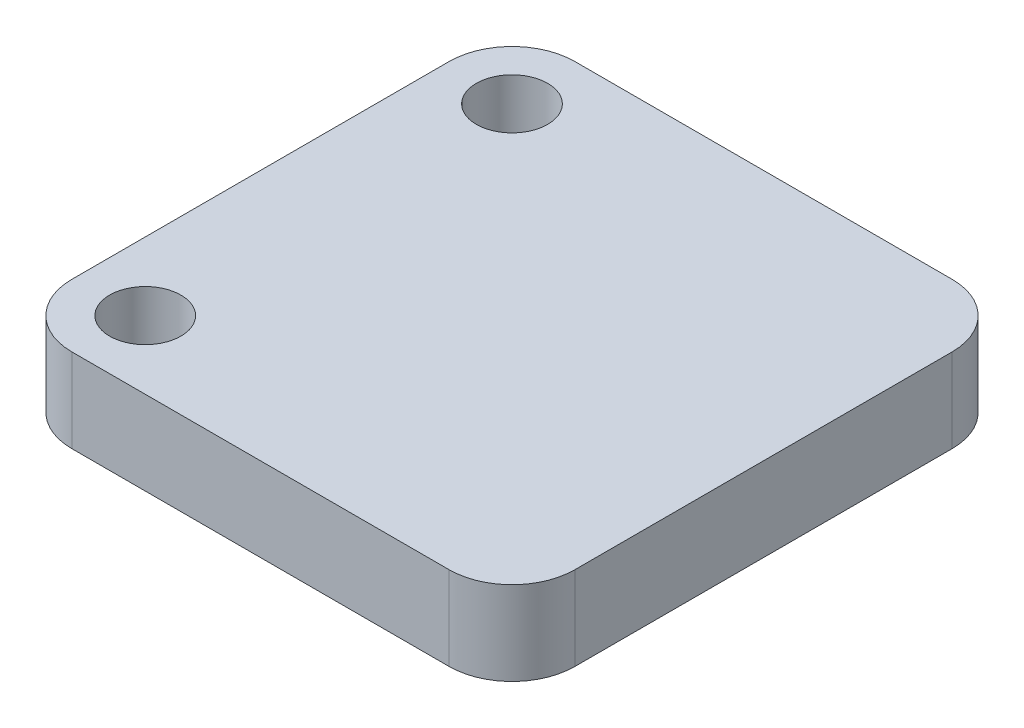
ISO-10303-21;
HEADER;
FILE_DESCRIPTION(('STEP AP214'),'2;1');
FILE_NAME('part.step','',(''),(''),'','','');
FILE_SCHEMA(('AUTOMOTIVE_DESIGN { 1 0 10303 214 1 1 1 1 }'));
ENDSEC;
DATA;
#1=APPLICATION_CONTEXT('core data for automotive mechanical design processes');
#2=APPLICATION_PROTOCOL_DEFINITION('international standard','automotive_design',2000,#1);
#3=PRODUCT_CONTEXT('',#1,'mechanical');
#4=PRODUCT('Part','Part','',(#3));
#5=PRODUCT_RELATED_PRODUCT_CATEGORY('part','',(#4));
#6=PRODUCT_DEFINITION_FORMATION('','',#4);
#7=PRODUCT_DEFINITION_CONTEXT('part definition',#1,'design');
#8=PRODUCT_DEFINITION('design','',#6,#7);
#9=PRODUCT_DEFINITION_SHAPE('','',#8);
#10=(LENGTH_UNIT() NAMED_UNIT(*) SI_UNIT(.MILLI.,.METRE.));
#11=(NAMED_UNIT(*) PLANE_ANGLE_UNIT() SI_UNIT($,.RADIAN.));
#12=(NAMED_UNIT(*) SI_UNIT($,.STERADIAN.) SOLID_ANGLE_UNIT());
#13=UNCERTAINTY_MEASURE_WITH_UNIT(LENGTH_MEASURE(1.E-05),#10,'distance_accuracy_value','');
#14=(GEOMETRIC_REPRESENTATION_CONTEXT(3) GLOBAL_UNCERTAINTY_ASSIGNED_CONTEXT((#13)) GLOBAL_UNIT_ASSIGNED_CONTEXT((#10,
#11,#12)) REPRESENTATION_CONTEXT('',''));
#15=CARTESIAN_POINT('',(0.,0.,0.));
#16=DIRECTION('',(0.,0.,1.));
#17=DIRECTION('',(1.,0.,0.));
#18=AXIS2_PLACEMENT_3D('',#15,#16,#17);
#19=CARTESIAN_POINT('',(12.,4.,-12.));
#20=DIRECTION('',(-1.,0.,0.));
#21=DIRECTION('',(0.,0.,1.));
#22=AXIS2_PLACEMENT_3D('',#19,#20,#21);
#23=PLANE('',#22);
#24=DIRECTION('',(0.,0.,-1.));
#25=VECTOR('',#24,1.);
#26=CARTESIAN_POINT('',(12.,4.,-12.));
#27=LINE('',#26,#25);
#28=CARTESIAN_POINT('',(12.,4.,9.));
#29=VERTEX_POINT('',#28);
#30=CARTESIAN_POINT('',(12.,4.,-9.));
#31=VERTEX_POINT('',#30);
#32=EDGE_CURVE('E117',#29,#31,#27,.T.);
#33=ORIENTED_EDGE('',*,*,#32,.F.);
#34=DIRECTION('',(0.,-1.,0.));
#35=VECTOR('',#34,1.);
#36=CARTESIAN_POINT('',(12.,4.,9.));
#37=LINE('',#36,#35);
#38=CARTESIAN_POINT('',(12.,0.,9.));
#39=VERTEX_POINT('',#38);
#40=EDGE_CURVE('E102',#29,#39,#37,.T.);
#41=ORIENTED_EDGE('',*,*,#40,.T.);
#42=DIRECTION('',(0.,0.,-1.));
#43=VECTOR('',#42,1.);
#44=CARTESIAN_POINT('',(12.,0.,-12.));
#45=LINE('',#44,#43);
#46=CARTESIAN_POINT('',(12.,0.,-9.));
#47=VERTEX_POINT('',#46);
#48=EDGE_CURVE('E114',#39,#47,#45,.T.);
#49=ORIENTED_EDGE('',*,*,#48,.T.);
#50=DIRECTION('',(0.,-1.,0.));
#51=VECTOR('',#50,1.);
#52=CARTESIAN_POINT('',(12.,4.,-9.));
#53=LINE('',#52,#51);
#54=EDGE_CURVE('E119',#47,#31,#53,.F.);
#55=ORIENTED_EDGE('',*,*,#54,.T.);
#56=EDGE_LOOP('',(#33,#41,#49,#55));
#57=FACE_BOUND('',#56,.T.);
#58=ADVANCED_FACE('F32',(#57),#23,.F.);
#59=CARTESIAN_POINT('',(-12.,4.,-12.));
#60=DIRECTION('',(0.,0.,1.));
#61=DIRECTION('',(1.,0.,0.));
#62=AXIS2_PLACEMENT_3D('',#59,#60,#61);
#63=PLANE('',#62);
#64=DIRECTION('',(-1.,0.,0.));
#65=VECTOR('',#64,1.);
#66=CARTESIAN_POINT('',(-12.,4.,-12.));
#67=LINE('',#66,#65);
#68=CARTESIAN_POINT('',(9.,4.,-12.));
#69=VERTEX_POINT('',#68);
#70=CARTESIAN_POINT('',(-9.,4.,-12.));
#71=VERTEX_POINT('',#70);
#72=EDGE_CURVE('E163',#69,#71,#67,.T.);
#73=ORIENTED_EDGE('',*,*,#72,.F.);
#74=DIRECTION('',(0.,-1.,0.));
#75=VECTOR('',#74,1.);
#76=CARTESIAN_POINT('',(9.,4.,-12.));
#77=LINE('',#76,#75);
#78=CARTESIAN_POINT('',(9.,0.,-12.));
#79=VERTEX_POINT('',#78);
#80=EDGE_CURVE('E156',#69,#79,#77,.T.);
#81=ORIENTED_EDGE('',*,*,#80,.T.);
#82=DIRECTION('',(-1.,0.,0.));
#83=VECTOR('',#82,1.);
#84=CARTESIAN_POINT('',(-12.,0.,-12.));
#85=LINE('',#84,#83);
#86=CARTESIAN_POINT('',(-9.,0.,-12.));
#87=VERTEX_POINT('',#86);
#88=EDGE_CURVE('E123',#79,#87,#85,.T.);
#89=ORIENTED_EDGE('',*,*,#88,.T.);
#90=DIRECTION('',(0.,-1.,0.));
#91=VECTOR('',#90,1.);
#92=CARTESIAN_POINT('',(-9.,4.,-12.));
#93=LINE('',#92,#91);
#94=EDGE_CURVE('E154',#87,#71,#93,.F.);
#95=ORIENTED_EDGE('',*,*,#94,.T.);
#96=EDGE_LOOP('',(#73,#81,#89,#95));
#97=FACE_BOUND('',#96,.T.);
#98=ADVANCED_FACE('F161',(#97),#63,.F.);
#99=CARTESIAN_POINT('',(-12.,4.,-12.));
#100=DIRECTION('',(1.,0.,0.));
#101=DIRECTION('',(0.,0.,-1.));
#102=AXIS2_PLACEMENT_3D('',#99,#100,#101);
#103=PLANE('',#102);
#104=DIRECTION('',(0.,0.,1.));
#105=VECTOR('',#104,1.);
#106=CARTESIAN_POINT('',(-12.,4.,-12.));
#107=LINE('',#106,#105);
#108=CARTESIAN_POINT('',(-12.,4.,-9.));
#109=VERTEX_POINT('',#108);
#110=CARTESIAN_POINT('',(-12.,4.,9.));
#111=VERTEX_POINT('',#110);
#112=EDGE_CURVE('E171',#109,#111,#107,.T.);
#113=ORIENTED_EDGE('',*,*,#112,.F.);
#114=DIRECTION('',(0.,-1.,0.));
#115=VECTOR('',#114,1.);
#116=CARTESIAN_POINT('',(-12.,4.,-9.));
#117=LINE('',#116,#115);
#118=CARTESIAN_POINT('',(-12.,0.,-9.));
#119=VERTEX_POINT('',#118);
#120=EDGE_CURVE('E11',#109,#119,#117,.T.);
#121=ORIENTED_EDGE('',*,*,#120,.T.);
#122=DIRECTION('',(0.,0.,1.));
#123=VECTOR('',#122,1.);
#124=CARTESIAN_POINT('',(-12.,0.,-12.));
#125=LINE('',#124,#123);
#126=CARTESIAN_POINT('',(-12.,0.,9.));
#127=VERTEX_POINT('',#126);
#128=EDGE_CURVE('E127',#119,#127,#125,.T.);
#129=ORIENTED_EDGE('',*,*,#128,.T.);
#130=DIRECTION('',(0.,-1.,0.));
#131=VECTOR('',#130,1.);
#132=CARTESIAN_POINT('',(-12.,4.,9.));
#133=LINE('',#132,#131);
#134=EDGE_CURVE('E40',#127,#111,#133,.F.);
#135=ORIENTED_EDGE('',*,*,#134,.T.);
#136=EDGE_LOOP('',(#113,#121,#129,#135));
#137=FACE_BOUND('',#136,.T.);
#138=ADVANCED_FACE('F170',(#137),#103,.F.);
#139=CARTESIAN_POINT('',(-12.,4.,12.));
#140=DIRECTION('',(0.,0.,-1.));
#141=DIRECTION('',(-1.,0.,0.));
#142=AXIS2_PLACEMENT_3D('',#139,#140,#141);
#143=PLANE('',#142);
#144=DIRECTION('',(1.,0.,0.));
#145=VECTOR('',#144,1.);
#146=CARTESIAN_POINT('',(-12.,0.,12.));
#147=LINE('',#146,#145);
#148=CARTESIAN_POINT('',(-9.,0.,12.));
#149=VERTEX_POINT('',#148);
#150=CARTESIAN_POINT('',(9.,0.,12.));
#151=VERTEX_POINT('',#150);
#152=EDGE_CURVE('E137',#149,#151,#147,.T.);
#153=ORIENTED_EDGE('',*,*,#152,.T.);
#154=DIRECTION('',(0.,-1.,0.));
#155=VECTOR('',#154,1.);
#156=CARTESIAN_POINT('',(9.,4.,12.));
#157=LINE('',#156,#155);
#158=CARTESIAN_POINT('',(9.,4.,12.));
#159=VERTEX_POINT('',#158);
#160=EDGE_CURVE('E103',#151,#159,#157,.F.);
#161=ORIENTED_EDGE('',*,*,#160,.T.);
#162=DIRECTION('',(1.,0.,0.));
#163=VECTOR('',#162,1.);
#164=CARTESIAN_POINT('',(-12.,4.,12.));
#165=LINE('',#164,#163);
#166=CARTESIAN_POINT('',(-9.,4.,12.));
#167=VERTEX_POINT('',#166);
#168=EDGE_CURVE('E133',#167,#159,#165,.T.);
#169=ORIENTED_EDGE('',*,*,#168,.F.);
#170=DIRECTION('',(0.,-1.,0.));
#171=VECTOR('',#170,1.);
#172=CARTESIAN_POINT('',(-9.,4.,12.));
#173=LINE('',#172,#171);
#174=EDGE_CURVE('E108',#167,#149,#173,.T.);
#175=ORIENTED_EDGE('',*,*,#174,.T.);
#176=EDGE_LOOP('',(#153,#161,#169,#175));
#177=FACE_BOUND('',#176,.T.);
#178=ADVANCED_FACE('F191',(#177),#143,.F.);
#179=CARTESIAN_POINT('',(0.,4.,0.));
#180=DIRECTION('',(0.,1.,0.));
#181=DIRECTION('',(0.,0.,1.));
#182=AXIS2_PLACEMENT_3D('',#179,#180,#181);
#183=PLANE('',#182);
#184=CARTESIAN_POINT('',(-8.75,4.,-8.75));
#185=DIRECTION('',(0.,1.,0.));
#186=DIRECTION('',(0.,0.,1.));
#187=AXIS2_PLACEMENT_3D('',#184,#185,#186);
#188=CIRCLE('',#187,1.69999999999999);
#189=CARTESIAN_POINT('',(-8.75,4.,-7.05000000000001));
#190=VERTEX_POINT('',#189);
#191=EDGE_CURVE('E182',#190,#190,#188,.T.);
#192=ORIENTED_EDGE('',*,*,#191,.F.);
#193=EDGE_LOOP('',(#192));
#194=FACE_BOUND('',#193,.T.);
#195=CARTESIAN_POINT('',(-8.75,4.,8.75));
#196=DIRECTION('',(0.,1.,0.));
#197=DIRECTION('',(0.,0.,1.));
#198=AXIS2_PLACEMENT_3D('',#195,#196,#197);
#199=CIRCLE('',#198,1.69999999999999);
#200=CARTESIAN_POINT('',(-8.75,4.,10.45));
#201=VERTEX_POINT('',#200);
#202=EDGE_CURVE('E130',#201,#201,#199,.T.);
#203=ORIENTED_EDGE('',*,*,#202,.F.);
#204=EDGE_LOOP('',(#203));
#205=FACE_BOUND('',#204,.T.);
#206=ORIENTED_EDGE('',*,*,#168,.T.);
#207=CARTESIAN_POINT('',(9.,4.,9.));
#208=DIRECTION('',(0.,1.,0.));
#209=DIRECTION('',(0.,0.,1.));
#210=AXIS2_PLACEMENT_3D('',#207,#208,#209);
#211=CIRCLE('',#210,3.);
#212=EDGE_CURVE('E152',#159,#29,#211,.T.);
#213=ORIENTED_EDGE('',*,*,#212,.T.);
#214=ORIENTED_EDGE('',*,*,#32,.T.);
#215=CARTESIAN_POINT('',(9.,4.,-9.));
#216=DIRECTION('',(0.,1.,0.));
#217=DIRECTION('',(0.,0.,1.));
#218=AXIS2_PLACEMENT_3D('',#215,#216,#217);
#219=CIRCLE('',#218,3.);
#220=EDGE_CURVE('E150',#31,#69,#219,.T.);
#221=ORIENTED_EDGE('',*,*,#220,.T.);
#222=ORIENTED_EDGE('',*,*,#72,.T.);
#223=CARTESIAN_POINT('',(-9.,4.,-9.));
#224=DIRECTION('',(0.,1.,0.));
#225=DIRECTION('',(0.,0.,1.));
#226=AXIS2_PLACEMENT_3D('',#223,#224,#225);
#227=CIRCLE('',#226,3.);
#228=EDGE_CURVE('E53',#71,#109,#227,.T.);
#229=ORIENTED_EDGE('',*,*,#228,.T.);
#230=ORIENTED_EDGE('',*,*,#112,.T.);
#231=CARTESIAN_POINT('',(-9.,4.,9.));
#232=DIRECTION('',(0.,1.,0.));
#233=DIRECTION('',(0.,0.,1.));
#234=AXIS2_PLACEMENT_3D('',#231,#232,#233);
#235=CIRCLE('',#234,3.);
#236=EDGE_CURVE('E147',#111,#167,#235,.T.);
#237=ORIENTED_EDGE('',*,*,#236,.T.);
#238=EDGE_LOOP('',(#206,#213,#214,#221,#222,#229,#230,#237));
#239=FACE_BOUND('',#238,.T.);
#240=ADVANCED_FACE('F188',(#194,#205,#239),#183,.T.);
#241=CARTESIAN_POINT('',(0.,0.,0.));
#242=DIRECTION('',(0.,1.,0.));
#243=DIRECTION('',(0.,0.,1.));
#244=AXIS2_PLACEMENT_3D('',#241,#242,#243);
#245=PLANE('',#244);
#246=CARTESIAN_POINT('',(-8.75,0.,-8.75));
#247=DIRECTION('',(0.,1.,0.));
#248=DIRECTION('',(0.,0.,1.));
#249=AXIS2_PLACEMENT_3D('',#246,#247,#248);
#250=CIRCLE('',#249,1.7);
#251=CARTESIAN_POINT('',(-8.75,0.,-7.05));
#252=VERTEX_POINT('',#251);
#253=EDGE_CURVE('E179',#252,#252,#250,.T.);
#254=ORIENTED_EDGE('',*,*,#253,.T.);
#255=EDGE_LOOP('',(#254));
#256=FACE_BOUND('',#255,.T.);
#257=CARTESIAN_POINT('',(-8.75,0.,8.75));
#258=DIRECTION('',(0.,1.,0.));
#259=DIRECTION('',(0.,0.,1.));
#260=AXIS2_PLACEMENT_3D('',#257,#258,#259);
#261=CIRCLE('',#260,1.7);
#262=CARTESIAN_POINT('',(-8.75,0.,10.45));
#263=VERTEX_POINT('',#262);
#264=EDGE_CURVE('E124',#263,#263,#261,.T.);
#265=ORIENTED_EDGE('',*,*,#264,.T.);
#266=EDGE_LOOP('',(#265));
#267=FACE_BOUND('',#266,.T.);
#268=ORIENTED_EDGE('',*,*,#48,.F.);
#269=CARTESIAN_POINT('',(9.,0.,9.));
#270=DIRECTION('',(0.,1.,0.));
#271=DIRECTION('',(0.,0.,1.));
#272=AXIS2_PLACEMENT_3D('',#269,#270,#271);
#273=CIRCLE('',#272,3.);
#274=EDGE_CURVE('E98',#39,#151,#273,.F.);
#275=ORIENTED_EDGE('',*,*,#274,.T.);
#276=ORIENTED_EDGE('',*,*,#152,.F.);
#277=CARTESIAN_POINT('',(-9.,0.,9.));
#278=DIRECTION('',(0.,1.,0.));
#279=DIRECTION('',(0.,0.,1.));
#280=AXIS2_PLACEMENT_3D('',#277,#278,#279);
#281=CIRCLE('',#280,3.);
#282=EDGE_CURVE('E118',#149,#127,#281,.F.);
#283=ORIENTED_EDGE('',*,*,#282,.T.);
#284=ORIENTED_EDGE('',*,*,#128,.F.);
#285=CARTESIAN_POINT('',(-9.,0.,-9.));
#286=DIRECTION('',(0.,1.,0.));
#287=DIRECTION('',(0.,0.,1.));
#288=AXIS2_PLACEMENT_3D('',#285,#286,#287);
#289=CIRCLE('',#288,3.);
#290=EDGE_CURVE('E141',#119,#87,#289,.F.);
#291=ORIENTED_EDGE('',*,*,#290,.T.);
#292=ORIENTED_EDGE('',*,*,#88,.F.);
#293=CARTESIAN_POINT('',(9.,0.,-9.));
#294=DIRECTION('',(0.,1.,0.));
#295=DIRECTION('',(0.,0.,1.));
#296=AXIS2_PLACEMENT_3D('',#293,#294,#295);
#297=CIRCLE('',#296,3.);
#298=EDGE_CURVE('E109',#79,#47,#297,.F.);
#299=ORIENTED_EDGE('',*,*,#298,.T.);
#300=EDGE_LOOP('',(#268,#275,#276,#283,#284,#291,#292,#299));
#301=FACE_BOUND('',#300,.T.);
#302=ADVANCED_FACE('F121',(#256,#267,#301),#245,.F.);
#303=CARTESIAN_POINT('',(-8.75,4.,8.75));
#304=DIRECTION('',(0.,1.,0.));
#305=DIRECTION('',(0.,0.,1.));
#306=AXIS2_PLACEMENT_3D('',#303,#304,#305);
#307=CYLINDRICAL_SURFACE('',#306,1.69999999999999);
#308=ORIENTED_EDGE('',*,*,#264,.F.);
#309=EDGE_LOOP('',(#308));
#310=FACE_BOUND('',#309,.T.);
#311=ORIENTED_EDGE('',*,*,#202,.T.);
#312=EDGE_LOOP('',(#311));
#313=FACE_BOUND('',#312,.T.);
#314=ADVANCED_FACE('F243',(#310,#313),#307,.F.);
#315=CARTESIAN_POINT('',(-8.75,4.,-8.75));
#316=DIRECTION('',(0.,1.,0.));
#317=DIRECTION('',(0.,0.,1.));
#318=AXIS2_PLACEMENT_3D('',#315,#316,#317);
#319=CYLINDRICAL_SURFACE('',#318,1.69999999999999);
#320=ORIENTED_EDGE('',*,*,#253,.F.);
#321=EDGE_LOOP('',(#320));
#322=FACE_BOUND('',#321,.T.);
#323=ORIENTED_EDGE('',*,*,#191,.T.);
#324=EDGE_LOOP('',(#323));
#325=FACE_BOUND('',#324,.T.);
#326=ADVANCED_FACE('F186',(#322,#325),#319,.F.);
#327=CARTESIAN_POINT('',(9.,4.,9.));
#328=DIRECTION('',(0.,-1.,0.));
#329=DIRECTION('',(0.,0.,-1.));
#330=AXIS2_PLACEMENT_3D('',#327,#328,#329);
#331=CYLINDRICAL_SURFACE('',#330,3.);
#332=ORIENTED_EDGE('',*,*,#212,.F.);
#333=ORIENTED_EDGE('',*,*,#160,.F.);
#334=ORIENTED_EDGE('',*,*,#274,.F.);
#335=ORIENTED_EDGE('',*,*,#40,.F.);
#336=EDGE_LOOP('',(#332,#333,#334,#335));
#337=FACE_BOUND('',#336,.T.);
#338=ADVANCED_FACE('F101',(#337),#331,.T.);
#339=CARTESIAN_POINT('',(9.,4.,-9.));
#340=DIRECTION('',(0.,-1.,0.));
#341=DIRECTION('',(0.,0.,-1.));
#342=AXIS2_PLACEMENT_3D('',#339,#340,#341);
#343=CYLINDRICAL_SURFACE('',#342,3.);
#344=ORIENTED_EDGE('',*,*,#220,.F.);
#345=ORIENTED_EDGE('',*,*,#54,.F.);
#346=ORIENTED_EDGE('',*,*,#298,.F.);
#347=ORIENTED_EDGE('',*,*,#80,.F.);
#348=EDGE_LOOP('',(#344,#345,#346,#347));
#349=FACE_BOUND('',#348,.T.);
#350=ADVANCED_FACE('F202',(#349),#343,.T.);
#351=CARTESIAN_POINT('',(-9.,4.,-9.));
#352=DIRECTION('',(0.,-1.,0.));
#353=DIRECTION('',(0.,0.,-1.));
#354=AXIS2_PLACEMENT_3D('',#351,#352,#353);
#355=CYLINDRICAL_SURFACE('',#354,3.);
#356=ORIENTED_EDGE('',*,*,#228,.F.);
#357=ORIENTED_EDGE('',*,*,#94,.F.);
#358=ORIENTED_EDGE('',*,*,#290,.F.);
#359=ORIENTED_EDGE('',*,*,#120,.F.);
#360=EDGE_LOOP('',(#356,#357,#358,#359));
#361=FACE_BOUND('',#360,.T.);
#362=ADVANCED_FACE('F169',(#361),#355,.T.);
#363=CARTESIAN_POINT('',(-9.,4.,9.));
#364=DIRECTION('',(0.,-1.,0.));
#365=DIRECTION('',(0.,0.,-1.));
#366=AXIS2_PLACEMENT_3D('',#363,#364,#365);
#367=CYLINDRICAL_SURFACE('',#366,3.);
#368=ORIENTED_EDGE('',*,*,#236,.F.);
#369=ORIENTED_EDGE('',*,*,#134,.F.);
#370=ORIENTED_EDGE('',*,*,#282,.F.);
#371=ORIENTED_EDGE('',*,*,#174,.F.);
#372=EDGE_LOOP('',(#368,#369,#370,#371));
#373=FACE_BOUND('',#372,.T.);
#374=ADVANCED_FACE('F34',(#373),#367,.T.);
#375=CLOSED_SHELL('',(#58,#98,#138,#178,#240,#302,#314,#326,#338,#350,#362,#374));
#376=MANIFOLD_SOLID_BREP('B2',#375);
#377=ADVANCED_BREP_SHAPE_REPRESENTATION('',(#18,#376),#14);
#378=SHAPE_DEFINITION_REPRESENTATION(#9,#377);
ENDSEC;
END-ISO-10303-21;
